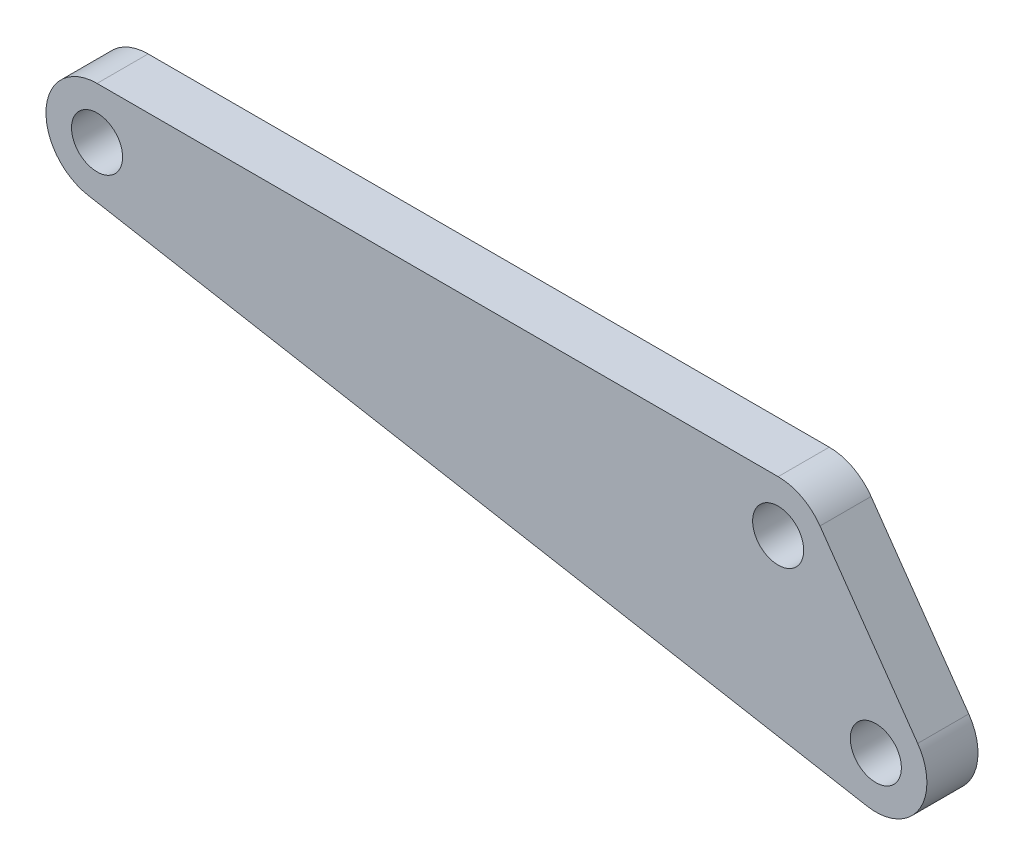
ISO-10303-21;
HEADER;
FILE_DESCRIPTION(('STEP AP214'),'2;1');
FILE_NAME('part.step','',(''),(''),'','','');
FILE_SCHEMA(('AUTOMOTIVE_DESIGN { 1 0 10303 214 1 1 1 1 }'));
ENDSEC;
DATA;
#1=APPLICATION_CONTEXT('core data for automotive mechanical design processes');
#2=APPLICATION_PROTOCOL_DEFINITION('international standard','automotive_design',2000,#1);
#3=PRODUCT_CONTEXT('',#1,'mechanical');
#4=PRODUCT('Part','Part','',(#3));
#5=PRODUCT_RELATED_PRODUCT_CATEGORY('part','',(#4));
#6=PRODUCT_DEFINITION_FORMATION('','',#4);
#7=PRODUCT_DEFINITION_CONTEXT('part definition',#1,'design');
#8=PRODUCT_DEFINITION('design','',#6,#7);
#9=PRODUCT_DEFINITION_SHAPE('','',#8);
#10=(LENGTH_UNIT() NAMED_UNIT(*) SI_UNIT(.MILLI.,.METRE.));
#11=(NAMED_UNIT(*) PLANE_ANGLE_UNIT() SI_UNIT($,.RADIAN.));
#12=(NAMED_UNIT(*) SI_UNIT($,.STERADIAN.) SOLID_ANGLE_UNIT());
#13=UNCERTAINTY_MEASURE_WITH_UNIT(LENGTH_MEASURE(1.E-05),#10,'distance_accuracy_value','');
#14=(GEOMETRIC_REPRESENTATION_CONTEXT(3) GLOBAL_UNCERTAINTY_ASSIGNED_CONTEXT((#13)) GLOBAL_UNIT_ASSIGNED_CONTEXT((#10,
#11,#12)) REPRESENTATION_CONTEXT('',''));
#15=CARTESIAN_POINT('',(0.,0.,0.));
#16=DIRECTION('',(0.,0.,1.));
#17=DIRECTION('',(1.,0.,0.));
#18=AXIS2_PLACEMENT_3D('',#15,#16,#17);
#19=CARTESIAN_POINT('',(0.,0.,3.));
#20=DIRECTION('',(0.,0.,1.));
#21=DIRECTION('',(1.,0.,0.));
#22=AXIS2_PLACEMENT_3D('',#19,#20,#21);
#23=PLANE('',#22);
#24=CARTESIAN_POINT('',(0.,0.,3.));
#25=DIRECTION('',(0.,0.,1.));
#26=DIRECTION('',(1.,0.,0.));
#27=AXIS2_PLACEMENT_3D('',#24,#25,#26);
#28=CIRCLE('',#27,1.5);
#29=CARTESIAN_POINT('',(1.5,0.,3.));
#30=VERTEX_POINT('',#29);
#31=EDGE_CURVE('E207',#30,#30,#28,.T.);
#32=ORIENTED_EDGE('',*,*,#31,.F.);
#33=EDGE_LOOP('',(#32));
#34=FACE_BOUND('',#33,.T.);
#35=CARTESIAN_POINT('',(0.,0.,3.));
#36=DIRECTION('',(0.,0.,1.));
#37=DIRECTION('',(1.,0.,0.));
#38=AXIS2_PLACEMENT_3D('',#35,#36,#37);
#39=CIRCLE('',#38,3.);
#40=CARTESIAN_POINT('',(2.45745613286697,1.72072930905315,3.));
#41=VERTEX_POINT('',#40);
#42=CARTESIAN_POINT('',(0.,3.,3.));
#43=VERTEX_POINT('',#42);
#44=EDGE_CURVE('E146',#41,#43,#39,.T.);
#45=ORIENTED_EDGE('',*,*,#44,.T.);
#46=DIRECTION('',(-1.,0.,0.));
#47=VECTOR('',#46,1.);
#48=CARTESIAN_POINT('',(-40.,3.,3.));
#49=LINE('',#48,#47);
#50=CARTESIAN_POINT('',(-40.,3.,3.));
#51=VERTEX_POINT('',#50);
#52=EDGE_CURVE('E94',#43,#51,#49,.T.);
#53=ORIENTED_EDGE('',*,*,#52,.T.);
#54=CARTESIAN_POINT('',(-40.,0.,3.));
#55=DIRECTION('',(0.,0.,1.));
#56=DIRECTION('',(1.,0.,0.));
#57=AXIS2_PLACEMENT_3D('',#54,#55,#56);
#58=CIRCLE('',#57,3.);
#59=CARTESIAN_POINT('',(-40.5288998194103,-2.95300947865525,3.));
#60=VERTEX_POINT('',#59);
#61=EDGE_CURVE('E107',#51,#60,#58,.T.);
#62=ORIENTED_EDGE('',*,*,#61,.T.);
#63=DIRECTION('',(0.984336492885084,-0.176299939803429,0.));
#64=VECTOR('',#63,1.);
#65=CARTESIAN_POINT('',(5.20686454410022,-11.1445299215451,3.));
#66=LINE('',#65,#64);
#67=CARTESIAN_POINT('',(5.20686454410022,-11.1445299215451,3.));
#68=VERTEX_POINT('',#67);
#69=EDGE_CURVE('E101',#60,#68,#66,.T.);
#70=ORIENTED_EDGE('',*,*,#69,.T.);
#71=CARTESIAN_POINT('',(5.7357643635105,-8.19152044288989,3.));
#72=DIRECTION('',(0.,0.,1.));
#73=DIRECTION('',(1.,0.,0.));
#74=AXIS2_PLACEMENT_3D('',#71,#72,#73);
#75=CIRCLE('',#74,3.);
#76=CARTESIAN_POINT('',(8.19322049637747,-6.47079113383674,3.));
#77=VERTEX_POINT('',#76);
#78=EDGE_CURVE('E105',#68,#77,#75,.T.);
#79=ORIENTED_EDGE('',*,*,#78,.T.);
#80=DIRECTION('',(-0.57357643635105,0.819152044288989,0.));
#81=VECTOR('',#80,1.);
#82=CARTESIAN_POINT('',(2.45745613286697,1.72072930905315,3.));
#83=LINE('',#82,#81);
#84=EDGE_CURVE('E57',#77,#41,#83,.T.);
#85=ORIENTED_EDGE('',*,*,#84,.T.);
#86=EDGE_LOOP('',(#45,#53,#62,#70,#79,#85));
#87=FACE_BOUND('',#86,.T.);
#88=CARTESIAN_POINT('',(-40.,0.,3.));
#89=DIRECTION('',(0.,0.,1.));
#90=DIRECTION('',(1.,0.,0.));
#91=AXIS2_PLACEMENT_3D('',#88,#89,#90);
#92=CIRCLE('',#91,1.5);
#93=CARTESIAN_POINT('',(-38.5,0.,3.));
#94=VERTEX_POINT('',#93);
#95=EDGE_CURVE('E134',#94,#94,#92,.T.);
#96=ORIENTED_EDGE('',*,*,#95,.F.);
#97=EDGE_LOOP('',(#96));
#98=FACE_BOUND('',#97,.T.);
#99=CARTESIAN_POINT('',(5.7357643635105,-8.19152044288989,3.));
#100=DIRECTION('',(0.,0.,1.));
#101=DIRECTION('',(1.,0.,0.));
#102=AXIS2_PLACEMENT_3D('',#99,#100,#101);
#103=CIRCLE('',#102,1.5);
#104=CARTESIAN_POINT('',(7.2357643635105,-8.19152044288989,3.));
#105=VERTEX_POINT('',#104);
#106=EDGE_CURVE('E196',#105,#105,#103,.T.);
#107=ORIENTED_EDGE('',*,*,#106,.F.);
#108=EDGE_LOOP('',(#107));
#109=FACE_BOUND('',#108,.T.);
#110=ADVANCED_FACE('F39',(#34,#87,#98,#109),#23,.T.);
#111=CARTESIAN_POINT('',(0.,0.,0.));
#112=DIRECTION('',(0.,0.,1.));
#113=DIRECTION('',(1.,0.,0.));
#114=AXIS2_PLACEMENT_3D('',#111,#112,#113);
#115=PLANE('',#114);
#116=CARTESIAN_POINT('',(0.,0.,0.));
#117=DIRECTION('',(0.,0.,1.));
#118=DIRECTION('',(1.,0.,0.));
#119=AXIS2_PLACEMENT_3D('',#116,#117,#118);
#120=CIRCLE('',#119,3.);
#121=CARTESIAN_POINT('',(2.45745613286697,1.72072930905315,0.));
#122=VERTEX_POINT('',#121);
#123=CARTESIAN_POINT('',(0.,3.,0.));
#124=VERTEX_POINT('',#123);
#125=EDGE_CURVE('E129',#122,#124,#120,.T.);
#126=ORIENTED_EDGE('',*,*,#125,.F.);
#127=DIRECTION('',(-0.57357643635105,0.819152044288989,0.));
#128=VECTOR('',#127,1.);
#129=CARTESIAN_POINT('',(2.45745613286697,1.72072930905315,0.));
#130=LINE('',#129,#128);
#131=CARTESIAN_POINT('',(8.19322049637747,-6.47079113383674,0.));
#132=VERTEX_POINT('',#131);
#133=EDGE_CURVE('E86',#132,#122,#130,.T.);
#134=ORIENTED_EDGE('',*,*,#133,.F.);
#135=CARTESIAN_POINT('',(5.7357643635105,-8.19152044288989,0.));
#136=DIRECTION('',(0.,0.,1.));
#137=DIRECTION('',(1.,0.,0.));
#138=AXIS2_PLACEMENT_3D('',#135,#136,#137);
#139=CIRCLE('',#138,3.);
#140=CARTESIAN_POINT('',(5.20686454410022,-11.1445299215451,0.));
#141=VERTEX_POINT('',#140);
#142=EDGE_CURVE('E80',#141,#132,#139,.T.);
#143=ORIENTED_EDGE('',*,*,#142,.F.);
#144=DIRECTION('',(0.984336492885084,-0.176299939803429,0.));
#145=VECTOR('',#144,1.);
#146=CARTESIAN_POINT('',(5.20686454410022,-11.1445299215451,0.));
#147=LINE('',#146,#145);
#148=CARTESIAN_POINT('',(-40.5288998194103,-2.95300947865525,0.));
#149=VERTEX_POINT('',#148);
#150=EDGE_CURVE('E116',#149,#141,#147,.T.);
#151=ORIENTED_EDGE('',*,*,#150,.F.);
#152=CARTESIAN_POINT('',(-40.,0.,0.));
#153=DIRECTION('',(0.,0.,1.));
#154=DIRECTION('',(1.,0.,0.));
#155=AXIS2_PLACEMENT_3D('',#152,#153,#154);
#156=CIRCLE('',#155,3.);
#157=CARTESIAN_POINT('',(-40.,3.,0.));
#158=VERTEX_POINT('',#157);
#159=EDGE_CURVE('E137',#158,#149,#156,.T.);
#160=ORIENTED_EDGE('',*,*,#159,.F.);
#161=DIRECTION('',(-1.,0.,0.));
#162=VECTOR('',#161,1.);
#163=CARTESIAN_POINT('',(-40.,3.,0.));
#164=LINE('',#163,#162);
#165=EDGE_CURVE('E133',#124,#158,#164,.T.);
#166=ORIENTED_EDGE('',*,*,#165,.F.);
#167=EDGE_LOOP('',(#126,#134,#143,#151,#160,#166));
#168=FACE_BOUND('',#167,.T.);
#169=CARTESIAN_POINT('',(-40.,0.,0.));
#170=DIRECTION('',(0.,0.,1.));
#171=DIRECTION('',(1.,0.,0.));
#172=AXIS2_PLACEMENT_3D('',#169,#170,#171);
#173=CIRCLE('',#172,1.5);
#174=CARTESIAN_POINT('',(-38.5,0.,0.));
#175=VERTEX_POINT('',#174);
#176=EDGE_CURVE('E211',#175,#175,#173,.T.);
#177=ORIENTED_EDGE('',*,*,#176,.T.);
#178=EDGE_LOOP('',(#177));
#179=FACE_BOUND('',#178,.T.);
#180=CARTESIAN_POINT('',(0.,0.,0.));
#181=DIRECTION('',(0.,0.,1.));
#182=DIRECTION('',(1.,0.,0.));
#183=AXIS2_PLACEMENT_3D('',#180,#181,#182);
#184=CIRCLE('',#183,1.5);
#185=CARTESIAN_POINT('',(1.5,0.,0.));
#186=VERTEX_POINT('',#185);
#187=EDGE_CURVE('E204',#186,#186,#184,.T.);
#188=ORIENTED_EDGE('',*,*,#187,.T.);
#189=EDGE_LOOP('',(#188));
#190=FACE_BOUND('',#189,.T.);
#191=CARTESIAN_POINT('',(5.7357643635105,-8.19152044288989,0.));
#192=DIRECTION('',(0.,0.,1.));
#193=DIRECTION('',(1.,0.,0.));
#194=AXIS2_PLACEMENT_3D('',#191,#192,#193);
#195=CIRCLE('',#194,1.5);
#196=CARTESIAN_POINT('',(7.2357643635105,-8.19152044288989,0.));
#197=VERTEX_POINT('',#196);
#198=EDGE_CURVE('E199',#197,#197,#195,.T.);
#199=ORIENTED_EDGE('',*,*,#198,.T.);
#200=EDGE_LOOP('',(#199));
#201=FACE_BOUND('',#200,.T.);
#202=ADVANCED_FACE('F159',(#168,#179,#190,#201),#115,.F.);
#203=CARTESIAN_POINT('',(0.,0.,3.));
#204=DIRECTION('',(0.,0.,-1.));
#205=DIRECTION('',(-1.,0.,0.));
#206=AXIS2_PLACEMENT_3D('',#203,#204,#205);
#207=CYLINDRICAL_SURFACE('',#206,3.);
#208=ORIENTED_EDGE('',*,*,#125,.T.);
#209=DIRECTION('',(0.,0.,-1.));
#210=VECTOR('',#209,1.);
#211=CARTESIAN_POINT('',(0.,3.,3.));
#212=LINE('',#211,#210);
#213=EDGE_CURVE('E11',#43,#124,#212,.T.);
#214=ORIENTED_EDGE('',*,*,#213,.F.);
#215=ORIENTED_EDGE('',*,*,#44,.F.);
#216=DIRECTION('',(0.,0.,-1.));
#217=VECTOR('',#216,1.);
#218=CARTESIAN_POINT('',(2.45745613286697,1.72072930905315,3.));
#219=LINE('',#218,#217);
#220=EDGE_CURVE('E125',#41,#122,#219,.T.);
#221=ORIENTED_EDGE('',*,*,#220,.T.);
#222=EDGE_LOOP('',(#208,#214,#215,#221));
#223=FACE_BOUND('',#222,.T.);
#224=ADVANCED_FACE('F41',(#223),#207,.T.);
#225=CARTESIAN_POINT('',(-40.,3.,3.));
#226=DIRECTION('',(0.,-1.,0.));
#227=DIRECTION('',(0.,0.,-1.));
#228=AXIS2_PLACEMENT_3D('',#225,#226,#227);
#229=PLANE('',#228);
#230=ORIENTED_EDGE('',*,*,#165,.T.);
#231=DIRECTION('',(0.,0.,-1.));
#232=VECTOR('',#231,1.);
#233=CARTESIAN_POINT('',(-40.,3.,3.));
#234=LINE('',#233,#232);
#235=EDGE_CURVE('E49',#51,#158,#234,.T.);
#236=ORIENTED_EDGE('',*,*,#235,.F.);
#237=ORIENTED_EDGE('',*,*,#52,.F.);
#238=ORIENTED_EDGE('',*,*,#213,.T.);
#239=EDGE_LOOP('',(#230,#236,#237,#238));
#240=FACE_BOUND('',#239,.T.);
#241=ADVANCED_FACE('F267',(#240),#229,.F.);
#242=CARTESIAN_POINT('',(-40.,0.,3.));
#243=DIRECTION('',(0.,0.,-1.));
#244=DIRECTION('',(-1.,0.,0.));
#245=AXIS2_PLACEMENT_3D('',#242,#243,#244);
#246=CYLINDRICAL_SURFACE('',#245,3.);
#247=ORIENTED_EDGE('',*,*,#159,.T.);
#248=DIRECTION('',(0.,0.,-1.));
#249=VECTOR('',#248,1.);
#250=CARTESIAN_POINT('',(-40.5288998194103,-2.95300947865525,3.));
#251=LINE('',#250,#249);
#252=EDGE_CURVE('E118',#60,#149,#251,.T.);
#253=ORIENTED_EDGE('',*,*,#252,.F.);
#254=ORIENTED_EDGE('',*,*,#61,.F.);
#255=ORIENTED_EDGE('',*,*,#235,.T.);
#256=EDGE_LOOP('',(#247,#253,#254,#255));
#257=FACE_BOUND('',#256,.T.);
#258=ADVANCED_FACE('F156',(#257),#246,.T.);
#259=CARTESIAN_POINT('',(5.20686454410022,-11.1445299215451,3.));
#260=DIRECTION('',(0.176299939803429,0.984336492885084,0.));
#261=DIRECTION('',(-0.984336492885084,0.176299939803429,0.));
#262=AXIS2_PLACEMENT_3D('',#259,#260,#261);
#263=PLANE('',#262);
#264=ORIENTED_EDGE('',*,*,#150,.T.);
#265=DIRECTION('',(0.,0.,-1.));
#266=VECTOR('',#265,1.);
#267=CARTESIAN_POINT('',(5.20686454410022,-11.1445299215451,3.));
#268=LINE('',#267,#266);
#269=EDGE_CURVE('E113',#68,#141,#268,.T.);
#270=ORIENTED_EDGE('',*,*,#269,.F.);
#271=ORIENTED_EDGE('',*,*,#69,.F.);
#272=ORIENTED_EDGE('',*,*,#252,.T.);
#273=EDGE_LOOP('',(#264,#270,#271,#272));
#274=FACE_BOUND('',#273,.T.);
#275=ADVANCED_FACE('F114',(#274),#263,.F.);
#276=CARTESIAN_POINT('',(5.7357643635105,-8.19152044288989,3.));
#277=DIRECTION('',(0.,0.,-1.));
#278=DIRECTION('',(-1.,0.,0.));
#279=AXIS2_PLACEMENT_3D('',#276,#277,#278);
#280=CYLINDRICAL_SURFACE('',#279,3.);
#281=ORIENTED_EDGE('',*,*,#142,.T.);
#282=DIRECTION('',(0.,0.,-1.));
#283=VECTOR('',#282,1.);
#284=CARTESIAN_POINT('',(8.19322049637747,-6.47079113383674,3.));
#285=LINE('',#284,#283);
#286=EDGE_CURVE('E119',#77,#132,#285,.T.);
#287=ORIENTED_EDGE('',*,*,#286,.F.);
#288=ORIENTED_EDGE('',*,*,#78,.F.);
#289=ORIENTED_EDGE('',*,*,#269,.T.);
#290=EDGE_LOOP('',(#281,#287,#288,#289));
#291=FACE_BOUND('',#290,.T.);
#292=ADVANCED_FACE('F121',(#291),#280,.T.);
#293=CARTESIAN_POINT('',(2.45745613286697,1.72072930905315,3.));
#294=DIRECTION('',(-0.819152044288989,-0.57357643635105,0.));
#295=DIRECTION('',(0.57357643635105,-0.819152044288989,0.));
#296=AXIS2_PLACEMENT_3D('',#293,#294,#295);
#297=PLANE('',#296);
#298=ORIENTED_EDGE('',*,*,#133,.T.);
#299=ORIENTED_EDGE('',*,*,#220,.F.);
#300=ORIENTED_EDGE('',*,*,#84,.F.);
#301=ORIENTED_EDGE('',*,*,#286,.T.);
#302=EDGE_LOOP('',(#298,#299,#300,#301));
#303=FACE_BOUND('',#302,.T.);
#304=ADVANCED_FACE('F164',(#303),#297,.F.);
#305=CARTESIAN_POINT('',(-40.,0.,3.));
#306=DIRECTION('',(0.,0.,-1.));
#307=DIRECTION('',(-1.,0.,0.));
#308=AXIS2_PLACEMENT_3D('',#305,#306,#307);
#309=CYLINDRICAL_SURFACE('',#308,1.5);
#310=ORIENTED_EDGE('',*,*,#95,.T.);
#311=EDGE_LOOP('',(#310));
#312=FACE_BOUND('',#311,.T.);
#313=ORIENTED_EDGE('',*,*,#176,.F.);
#314=EDGE_LOOP('',(#313));
#315=FACE_BOUND('',#314,.T.);
#316=ADVANCED_FACE('F166',(#312,#315),#309,.F.);
#317=CARTESIAN_POINT('',(0.,0.,3.));
#318=DIRECTION('',(0.,0.,-1.));
#319=DIRECTION('',(-1.,0.,0.));
#320=AXIS2_PLACEMENT_3D('',#317,#318,#319);
#321=CYLINDRICAL_SURFACE('',#320,1.5);
#322=ORIENTED_EDGE('',*,*,#31,.T.);
#323=EDGE_LOOP('',(#322));
#324=FACE_BOUND('',#323,.T.);
#325=ORIENTED_EDGE('',*,*,#187,.F.);
#326=EDGE_LOOP('',(#325));
#327=FACE_BOUND('',#326,.T.);
#328=ADVANCED_FACE('F172',(#324,#327),#321,.F.);
#329=CARTESIAN_POINT('',(5.7357643635105,-8.19152044288989,3.));
#330=DIRECTION('',(0.,0.,-1.));
#331=DIRECTION('',(-1.,0.,0.));
#332=AXIS2_PLACEMENT_3D('',#329,#330,#331);
#333=CYLINDRICAL_SURFACE('',#332,1.5);
#334=ORIENTED_EDGE('',*,*,#106,.T.);
#335=EDGE_LOOP('',(#334));
#336=FACE_BOUND('',#335,.T.);
#337=ORIENTED_EDGE('',*,*,#198,.F.);
#338=EDGE_LOOP('',(#337));
#339=FACE_BOUND('',#338,.T.);
#340=ADVANCED_FACE('F187',(#336,#339),#333,.F.);
#341=CLOSED_SHELL('',(#110,#202,#224,#241,#258,#275,#292,#304,#316,#328,#340));
#342=MANIFOLD_SOLID_BREP('B2',#341);
#343=ADVANCED_BREP_SHAPE_REPRESENTATION('',(#18,#342),#14);
#344=SHAPE_DEFINITION_REPRESENTATION(#9,#343);
ENDSEC;
END-ISO-10303-21;
